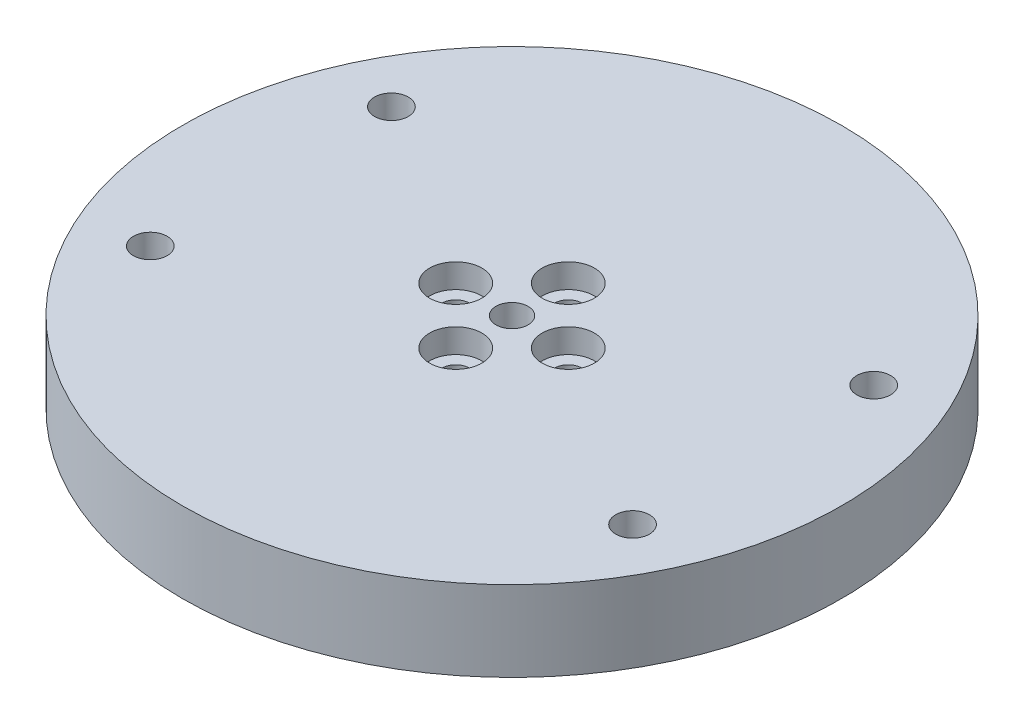
ISO-10303-21;
HEADER;
FILE_DESCRIPTION(('STEP AP214'),'2;1');
FILE_NAME('part.step','',(''),(''),'','','');
FILE_SCHEMA(('AUTOMOTIVE_DESIGN { 1 0 10303 214 1 1 1 1 }'));
ENDSEC;
DATA;
#1=APPLICATION_CONTEXT('core data for automotive mechanical design processes');
#2=APPLICATION_PROTOCOL_DEFINITION('international standard','automotive_design',2000,#1);
#3=PRODUCT_CONTEXT('',#1,'mechanical');
#4=PRODUCT('Part','Part','',(#3));
#5=PRODUCT_RELATED_PRODUCT_CATEGORY('part','',(#4));
#6=PRODUCT_DEFINITION_FORMATION('','',#4);
#7=PRODUCT_DEFINITION_CONTEXT('part definition',#1,'design');
#8=PRODUCT_DEFINITION('design','',#6,#7);
#9=PRODUCT_DEFINITION_SHAPE('','',#8);
#10=(LENGTH_UNIT() NAMED_UNIT(*) SI_UNIT(.MILLI.,.METRE.));
#11=(NAMED_UNIT(*) PLANE_ANGLE_UNIT() SI_UNIT($,.RADIAN.));
#12=(NAMED_UNIT(*) SI_UNIT($,.STERADIAN.) SOLID_ANGLE_UNIT());
#13=UNCERTAINTY_MEASURE_WITH_UNIT(LENGTH_MEASURE(1.E-05),#10,'distance_accuracy_value','');
#14=(GEOMETRIC_REPRESENTATION_CONTEXT(3) GLOBAL_UNCERTAINTY_ASSIGNED_CONTEXT((#13)) GLOBAL_UNIT_ASSIGNED_CONTEXT((#10,
#11,#12)) REPRESENTATION_CONTEXT('',''));
#15=CARTESIAN_POINT('',(0.,0.,0.));
#16=DIRECTION('',(0.,0.,1.));
#17=DIRECTION('',(1.,0.,0.));
#18=AXIS2_PLACEMENT_3D('',#15,#16,#17);
#19=CARTESIAN_POINT('',(7.,10.,0.));
#20=DIRECTION('',(0.,-1.,0.));
#21=DIRECTION('',(0.,0.,-1.));
#22=AXIS2_PLACEMENT_3D('',#19,#20,#21);
#23=CYLINDRICAL_SURFACE('',#22,1.7);
#24=CARTESIAN_POINT('',(7.,0.5,0.));
#25=DIRECTION('',(0.,-1.,0.));
#26=DIRECTION('',(0.,0.,-1.));
#27=AXIS2_PLACEMENT_3D('',#24,#25,#26);
#28=CIRCLE('',#27,1.7);
#29=CARTESIAN_POINT('',(7.,0.5,-1.70000000000002));
#30=VERTEX_POINT('',#29);
#31=EDGE_CURVE('E77',#30,#30,#28,.T.);
#32=ORIENTED_EDGE('',*,*,#31,.T.);
#33=EDGE_LOOP('',(#32));
#34=FACE_BOUND('',#33,.T.);
#35=CARTESIAN_POINT('',(7.,7.,0.));
#36=DIRECTION('',(0.,1.,0.));
#37=DIRECTION('',(0.,0.,1.));
#38=AXIS2_PLACEMENT_3D('',#35,#36,#37);
#39=CIRCLE('',#38,1.7);
#40=CARTESIAN_POINT('',(7.,7.,1.69999999999998));
#41=VERTEX_POINT('',#40);
#42=EDGE_CURVE('E43',#41,#41,#39,.F.);
#43=ORIENTED_EDGE('',*,*,#42,.F.);
#44=EDGE_LOOP('',(#43));
#45=FACE_BOUND('',#44,.T.);
#46=ADVANCED_FACE('F39',(#34,#45),#23,.F.);
#47=CARTESIAN_POINT('',(0.,10.,-7.));
#48=DIRECTION('',(0.,-1.,0.));
#49=DIRECTION('',(0.,0.,-1.));
#50=AXIS2_PLACEMENT_3D('',#47,#48,#49);
#51=CYLINDRICAL_SURFACE('',#50,1.7);
#52=CARTESIAN_POINT('',(0.,0.5,-7.));
#53=DIRECTION('',(0.,-1.,0.));
#54=DIRECTION('',(0.,0.,-1.));
#55=AXIS2_PLACEMENT_3D('',#52,#53,#54);
#56=CIRCLE('',#55,1.7);
#57=CARTESIAN_POINT('',(0.,0.5,-8.7));
#58=VERTEX_POINT('',#57);
#59=EDGE_CURVE('E71',#58,#58,#56,.T.);
#60=ORIENTED_EDGE('',*,*,#59,.T.);
#61=EDGE_LOOP('',(#60));
#62=FACE_BOUND('',#61,.T.);
#63=CARTESIAN_POINT('',(0.,7.,-7.));
#64=DIRECTION('',(0.,1.,0.));
#65=DIRECTION('',(0.,0.,1.));
#66=AXIS2_PLACEMENT_3D('',#63,#64,#65);
#67=CIRCLE('',#66,1.7);
#68=CARTESIAN_POINT('',(0.,7.,-5.3));
#69=VERTEX_POINT('',#68);
#70=EDGE_CURVE('E63',#69,#69,#67,.F.);
#71=ORIENTED_EDGE('',*,*,#70,.F.);
#72=EDGE_LOOP('',(#71));
#73=FACE_BOUND('',#72,.T.);
#74=ADVANCED_FACE('F187',(#62,#73),#51,.F.);
#75=CARTESIAN_POINT('',(-7.,10.,0.));
#76=DIRECTION('',(0.,-1.,0.));
#77=DIRECTION('',(0.,0.,-1.));
#78=AXIS2_PLACEMENT_3D('',#75,#76,#77);
#79=CYLINDRICAL_SURFACE('',#78,1.7);
#80=CARTESIAN_POINT('',(-7.,0.5,0.));
#81=DIRECTION('',(0.,-1.,0.));
#82=DIRECTION('',(0.,0.,-1.));
#83=AXIS2_PLACEMENT_3D('',#80,#81,#82);
#84=CIRCLE('',#83,1.7);
#85=CARTESIAN_POINT('',(-7.,0.5,-1.69999999999993));
#86=VERTEX_POINT('',#85);
#87=EDGE_CURVE('E69',#86,#86,#84,.T.);
#88=ORIENTED_EDGE('',*,*,#87,.T.);
#89=EDGE_LOOP('',(#88));
#90=FACE_BOUND('',#89,.T.);
#91=CARTESIAN_POINT('',(-7.,7.,0.));
#92=DIRECTION('',(0.,1.,0.));
#93=DIRECTION('',(0.,0.,1.));
#94=AXIS2_PLACEMENT_3D('',#91,#92,#93);
#95=CIRCLE('',#94,1.7);
#96=CARTESIAN_POINT('',(-7.,7.,1.70000000000007));
#97=VERTEX_POINT('',#96);
#98=EDGE_CURVE('E61',#97,#97,#95,.F.);
#99=ORIENTED_EDGE('',*,*,#98,.F.);
#100=EDGE_LOOP('',(#99));
#101=FACE_BOUND('',#100,.T.);
#102=ADVANCED_FACE('F191',(#90,#101),#79,.F.);
#103=CARTESIAN_POINT('',(0.,10.,7.));
#104=DIRECTION('',(0.,-1.,0.));
#105=DIRECTION('',(0.,0.,-1.));
#106=AXIS2_PLACEMENT_3D('',#103,#104,#105);
#107=CYLINDRICAL_SURFACE('',#106,1.7);
#108=CARTESIAN_POINT('',(0.,0.5,7.));
#109=DIRECTION('',(0.,-1.,0.));
#110=DIRECTION('',(0.,0.,-1.));
#111=AXIS2_PLACEMENT_3D('',#108,#109,#110);
#112=CIRCLE('',#111,1.7);
#113=CARTESIAN_POINT('',(0.,0.5,5.3));
#114=VERTEX_POINT('',#113);
#115=EDGE_CURVE('E82',#114,#114,#112,.T.);
#116=ORIENTED_EDGE('',*,*,#115,.T.);
#117=EDGE_LOOP('',(#116));
#118=FACE_BOUND('',#117,.T.);
#119=CARTESIAN_POINT('',(0.,7.,7.));
#120=DIRECTION('',(0.,1.,0.));
#121=DIRECTION('',(0.,0.,1.));
#122=AXIS2_PLACEMENT_3D('',#119,#120,#121);
#123=CIRCLE('',#122,1.7);
#124=CARTESIAN_POINT('',(0.,7.,8.7));
#125=VERTEX_POINT('',#124);
#126=EDGE_CURVE('E59',#125,#125,#123,.F.);
#127=ORIENTED_EDGE('',*,*,#126,.F.);
#128=EDGE_LOOP('',(#127));
#129=FACE_BOUND('',#128,.T.);
#130=ADVANCED_FACE('F200',(#118,#129),#107,.F.);
#131=CARTESIAN_POINT('',(0.,10.,0.));
#132=DIRECTION('',(0.,-1.,0.));
#133=DIRECTION('',(0.,0.,-1.));
#134=AXIS2_PLACEMENT_3D('',#131,#132,#133);
#135=CYLINDRICAL_SURFACE('',#134,41.);
#136=CARTESIAN_POINT('',(0.,10.,0.));
#137=DIRECTION('',(0.,1.,0.));
#138=DIRECTION('',(0.,0.,1.));
#139=AXIS2_PLACEMENT_3D('',#136,#137,#138);
#140=CIRCLE('',#139,41.);
#141=CARTESIAN_POINT('',(0.,10.,41.));
#142=VERTEX_POINT('',#141);
#143=EDGE_CURVE('E10',#142,#142,#140,.T.);
#144=ORIENTED_EDGE('',*,*,#143,.F.);
#145=EDGE_LOOP('',(#144));
#146=FACE_BOUND('',#145,.T.);
#147=CARTESIAN_POINT('',(0.,0.,0.));
#148=DIRECTION('',(0.,1.,0.));
#149=DIRECTION('',(0.,0.,1.));
#150=AXIS2_PLACEMENT_3D('',#147,#148,#149);
#151=CIRCLE('',#150,41.);
#152=CARTESIAN_POINT('',(0.,0.,41.));
#153=VERTEX_POINT('',#152);
#154=EDGE_CURVE('E50',#153,#153,#151,.T.);
#155=ORIENTED_EDGE('',*,*,#154,.T.);
#156=EDGE_LOOP('',(#155));
#157=FACE_BOUND('',#156,.T.);
#158=ADVANCED_FACE('F41',(#146,#157),#135,.T.);
#159=CARTESIAN_POINT('',(0.,10.,0.));
#160=DIRECTION('',(0.,1.,0.));
#161=DIRECTION('',(0.,0.,1.));
#162=AXIS2_PLACEMENT_3D('',#159,#160,#161);
#163=PLANE('',#162);
#164=CARTESIAN_POINT('',(-30.,10.,15.));
#165=DIRECTION('',(0.,1.,0.));
#166=DIRECTION('',(0.,0.,1.));
#167=AXIS2_PLACEMENT_3D('',#164,#165,#166);
#168=CIRCLE('',#167,2.1);
#169=CARTESIAN_POINT('',(-30.,10.,17.1));
#170=VERTEX_POINT('',#169);
#171=EDGE_CURVE('E130',#170,#170,#168,.T.);
#172=ORIENTED_EDGE('',*,*,#171,.F.);
#173=EDGE_LOOP('',(#172));
#174=FACE_BOUND('',#173,.T.);
#175=CARTESIAN_POINT('',(30.,10.,-15.));
#176=DIRECTION('',(0.,1.,0.));
#177=DIRECTION('',(0.,0.,1.));
#178=AXIS2_PLACEMENT_3D('',#175,#176,#177);
#179=CIRCLE('',#178,2.1);
#180=CARTESIAN_POINT('',(30.,10.,-12.9));
#181=VERTEX_POINT('',#180);
#182=EDGE_CURVE('E132',#181,#181,#179,.T.);
#183=ORIENTED_EDGE('',*,*,#182,.F.);
#184=EDGE_LOOP('',(#183));
#185=FACE_BOUND('',#184,.T.);
#186=CARTESIAN_POINT('',(30.,10.,15.));
#187=DIRECTION('',(0.,1.,0.));
#188=DIRECTION('',(0.,0.,1.));
#189=AXIS2_PLACEMENT_3D('',#186,#187,#188);
#190=CIRCLE('',#189,2.1);
#191=CARTESIAN_POINT('',(30.,10.,17.1));
#192=VERTEX_POINT('',#191);
#193=EDGE_CURVE('E133',#192,#192,#190,.T.);
#194=ORIENTED_EDGE('',*,*,#193,.F.);
#195=EDGE_LOOP('',(#194));
#196=FACE_BOUND('',#195,.T.);
#197=CARTESIAN_POINT('',(-30.,10.,-15.));
#198=DIRECTION('',(0.,1.,0.));
#199=DIRECTION('',(0.,0.,1.));
#200=AXIS2_PLACEMENT_3D('',#197,#198,#199);
#201=CIRCLE('',#200,2.1);
#202=CARTESIAN_POINT('',(-30.,10.,-12.9));
#203=VERTEX_POINT('',#202);
#204=EDGE_CURVE('E124',#203,#203,#201,.T.);
#205=ORIENTED_EDGE('',*,*,#204,.F.);
#206=EDGE_LOOP('',(#205));
#207=FACE_BOUND('',#206,.T.);
#208=CARTESIAN_POINT('',(0.,10.,-7.));
#209=DIRECTION('',(0.,1.,0.));
#210=DIRECTION('',(0.,0.,1.));
#211=AXIS2_PLACEMENT_3D('',#208,#209,#210);
#212=CIRCLE('',#211,3.25);
#213=CARTESIAN_POINT('',(0.,10.,-3.75));
#214=VERTEX_POINT('',#213);
#215=EDGE_CURVE('E118',#214,#214,#212,.T.);
#216=ORIENTED_EDGE('',*,*,#215,.F.);
#217=EDGE_LOOP('',(#216));
#218=FACE_BOUND('',#217,.T.);
#219=CARTESIAN_POINT('',(7.,10.,0.));
#220=DIRECTION('',(0.,1.,0.));
#221=DIRECTION('',(0.,0.,1.));
#222=AXIS2_PLACEMENT_3D('',#219,#220,#221);
#223=CIRCLE('',#222,3.25);
#224=CARTESIAN_POINT('',(7.,10.,3.24999999999998));
#225=VERTEX_POINT('',#224);
#226=EDGE_CURVE('E116',#225,#225,#223,.T.);
#227=ORIENTED_EDGE('',*,*,#226,.F.);
#228=EDGE_LOOP('',(#227));
#229=FACE_BOUND('',#228,.T.);
#230=CARTESIAN_POINT('',(0.,10.,7.));
#231=DIRECTION('',(0.,1.,0.));
#232=DIRECTION('',(0.,0.,1.));
#233=AXIS2_PLACEMENT_3D('',#230,#231,#232);
#234=CIRCLE('',#233,3.25);
#235=CARTESIAN_POINT('',(0.,10.,10.25));
#236=VERTEX_POINT('',#235);
#237=EDGE_CURVE('E109',#236,#236,#234,.T.);
#238=ORIENTED_EDGE('',*,*,#237,.F.);
#239=EDGE_LOOP('',(#238));
#240=FACE_BOUND('',#239,.T.);
#241=CARTESIAN_POINT('',(-7.,10.,0.));
#242=DIRECTION('',(0.,1.,0.));
#243=DIRECTION('',(0.,0.,1.));
#244=AXIS2_PLACEMENT_3D('',#241,#242,#243);
#245=CIRCLE('',#244,3.25);
#246=CARTESIAN_POINT('',(-7.,10.,3.24999999999998));
#247=VERTEX_POINT('',#246);
#248=EDGE_CURVE('E103',#247,#247,#245,.T.);
#249=ORIENTED_EDGE('',*,*,#248,.F.);
#250=EDGE_LOOP('',(#249));
#251=FACE_BOUND('',#250,.T.);
#252=CARTESIAN_POINT('',(0.,10.,0.));
#253=DIRECTION('',(0.,-1.,0.));
#254=DIRECTION('',(0.,0.,-1.));
#255=AXIS2_PLACEMENT_3D('',#252,#253,#254);
#256=CIRCLE('',#255,2.);
#257=CARTESIAN_POINT('',(0.,10.,-2.));
#258=VERTEX_POINT('',#257);
#259=EDGE_CURVE('E88',#258,#258,#256,.T.);
#260=ORIENTED_EDGE('',*,*,#259,.T.);
#261=EDGE_LOOP('',(#260));
#262=FACE_BOUND('',#261,.T.);
#263=ORIENTED_EDGE('',*,*,#143,.T.);
#264=EDGE_LOOP('',(#263));
#265=FACE_BOUND('',#264,.T.);
#266=ADVANCED_FACE('F147',(#174,#185,#196,#207,#218,#229,#240,#251,#262,#265),#163,.T.);
#267=CARTESIAN_POINT('',(0.,0.,0.));
#268=DIRECTION('',(0.,1.,0.));
#269=DIRECTION('',(0.,0.,1.));
#270=AXIS2_PLACEMENT_3D('',#267,#268,#269);
#271=PLANE('',#270);
#272=CARTESIAN_POINT('',(0.,0.,0.));
#273=DIRECTION('',(0.,-1.,0.));
#274=DIRECTION('',(0.,0.,-1.));
#275=AXIS2_PLACEMENT_3D('',#272,#273,#274);
#276=CIRCLE('',#275,10.1);
#277=CARTESIAN_POINT('',(0.,0.,-10.1));
#278=VERTEX_POINT('',#277);
#279=EDGE_CURVE('E54',#278,#278,#276,.T.);
#280=ORIENTED_EDGE('',*,*,#279,.F.);
#281=EDGE_LOOP('',(#280));
#282=FACE_BOUND('',#281,.T.);
#283=ORIENTED_EDGE('',*,*,#154,.F.);
#284=EDGE_LOOP('',(#283));
#285=FACE_BOUND('',#284,.T.);
#286=ADVANCED_FACE('F153',(#282,#285),#271,.F.);
#287=CARTESIAN_POINT('',(0.,0.5,0.));
#288=DIRECTION('',(0.,-1.,0.));
#289=DIRECTION('',(0.,0.,-1.));
#290=AXIS2_PLACEMENT_3D('',#287,#288,#289);
#291=CYLINDRICAL_SURFACE('',#290,10.1);
#292=CARTESIAN_POINT('',(0.,0.5,0.));
#293=DIRECTION('',(0.,-1.,0.));
#294=DIRECTION('',(0.,0.,-1.));
#295=AXIS2_PLACEMENT_3D('',#292,#293,#294);
#296=CIRCLE('',#295,10.1);
#297=CARTESIAN_POINT('',(0.,0.5,-10.1));
#298=VERTEX_POINT('',#297);
#299=EDGE_CURVE('E55',#298,#298,#296,.T.);
#300=ORIENTED_EDGE('',*,*,#299,.F.);
#301=EDGE_LOOP('',(#300));
#302=FACE_BOUND('',#301,.T.);
#303=ORIENTED_EDGE('',*,*,#279,.T.);
#304=EDGE_LOOP('',(#303));
#305=FACE_BOUND('',#304,.T.);
#306=ADVANCED_FACE('F180',(#302,#305),#291,.F.);
#307=CARTESIAN_POINT('',(0.,0.5,0.));
#308=DIRECTION('',(0.,-1.,0.));
#309=DIRECTION('',(0.,0.,-1.));
#310=AXIS2_PLACEMENT_3D('',#307,#308,#309);
#311=PLANE('',#310);
#312=ORIENTED_EDGE('',*,*,#115,.F.);
#313=EDGE_LOOP('',(#312));
#314=FACE_BOUND('',#313,.T.);
#315=ORIENTED_EDGE('',*,*,#87,.F.);
#316=EDGE_LOOP('',(#315));
#317=FACE_BOUND('',#316,.T.);
#318=ORIENTED_EDGE('',*,*,#59,.F.);
#319=EDGE_LOOP('',(#318));
#320=FACE_BOUND('',#319,.T.);
#321=ORIENTED_EDGE('',*,*,#31,.F.);
#322=EDGE_LOOP('',(#321));
#323=FACE_BOUND('',#322,.T.);
#324=CARTESIAN_POINT('',(0.,0.5,0.));
#325=DIRECTION('',(0.,-1.,0.));
#326=DIRECTION('',(0.,0.,-1.));
#327=AXIS2_PLACEMENT_3D('',#324,#325,#326);
#328=CIRCLE('',#327,2.);
#329=CARTESIAN_POINT('',(0.,0.5,-2.));
#330=VERTEX_POINT('',#329);
#331=EDGE_CURVE('E85',#330,#330,#328,.T.);
#332=ORIENTED_EDGE('',*,*,#331,.F.);
#333=EDGE_LOOP('',(#332));
#334=FACE_BOUND('',#333,.T.);
#335=ORIENTED_EDGE('',*,*,#299,.T.);
#336=EDGE_LOOP('',(#335));
#337=FACE_BOUND('',#336,.T.);
#338=ADVANCED_FACE('F175',(#314,#317,#320,#323,#334,#337),#311,.T.);
#339=CARTESIAN_POINT('',(0.,10.,0.));
#340=DIRECTION('',(0.,-1.,0.));
#341=DIRECTION('',(0.,0.,-1.));
#342=AXIS2_PLACEMENT_3D('',#339,#340,#341);
#343=CYLINDRICAL_SURFACE('',#342,2.);
#344=ORIENTED_EDGE('',*,*,#259,.F.);
#345=EDGE_LOOP('',(#344));
#346=FACE_BOUND('',#345,.T.);
#347=ORIENTED_EDGE('',*,*,#331,.T.);
#348=EDGE_LOOP('',(#347));
#349=FACE_BOUND('',#348,.T.);
#350=ADVANCED_FACE('F169',(#346,#349),#343,.F.);
#351=CARTESIAN_POINT('',(0.,7.,7.));
#352=DIRECTION('',(0.,1.,0.));
#353=DIRECTION('',(0.,0.,1.));
#354=AXIS2_PLACEMENT_3D('',#351,#352,#353);
#355=PLANE('',#354);
#356=CARTESIAN_POINT('',(0.,7.,7.));
#357=DIRECTION('',(0.,1.,0.));
#358=DIRECTION('',(0.,0.,1.));
#359=AXIS2_PLACEMENT_3D('',#356,#357,#358);
#360=CIRCLE('',#359,3.25);
#361=CARTESIAN_POINT('',(0.,7.,10.25));
#362=VERTEX_POINT('',#361);
#363=EDGE_CURVE('E110',#362,#362,#360,.T.);
#364=ORIENTED_EDGE('',*,*,#363,.T.);
#365=EDGE_LOOP('',(#364));
#366=FACE_BOUND('',#365,.T.);
#367=ORIENTED_EDGE('',*,*,#126,.T.);
#368=EDGE_LOOP('',(#367));
#369=FACE_BOUND('',#368,.T.);
#370=ADVANCED_FACE('F171',(#366,#369),#355,.T.);
#371=CARTESIAN_POINT('',(0.,7.,7.));
#372=DIRECTION('',(0.,1.,0.));
#373=DIRECTION('',(0.,0.,1.));
#374=AXIS2_PLACEMENT_3D('',#371,#372,#373);
#375=CYLINDRICAL_SURFACE('',#374,3.25);
#376=ORIENTED_EDGE('',*,*,#363,.F.);
#377=EDGE_LOOP('',(#376));
#378=FACE_BOUND('',#377,.T.);
#379=ORIENTED_EDGE('',*,*,#237,.T.);
#380=EDGE_LOOP('',(#379));
#381=FACE_BOUND('',#380,.T.);
#382=ADVANCED_FACE('F210',(#378,#381),#375,.F.);
#383=CARTESIAN_POINT('',(-7.,7.,0.));
#384=DIRECTION('',(0.,1.,0.));
#385=DIRECTION('',(0.,0.,1.));
#386=AXIS2_PLACEMENT_3D('',#383,#384,#385);
#387=PLANE('',#386);
#388=CARTESIAN_POINT('',(-7.,7.,0.));
#389=DIRECTION('',(0.,1.,0.));
#390=DIRECTION('',(0.,0.,1.));
#391=AXIS2_PLACEMENT_3D('',#388,#389,#390);
#392=CIRCLE('',#391,3.25);
#393=CARTESIAN_POINT('',(-7.,7.,3.24999999999998));
#394=VERTEX_POINT('',#393);
#395=EDGE_CURVE('E99',#394,#394,#392,.T.);
#396=ORIENTED_EDGE('',*,*,#395,.T.);
#397=EDGE_LOOP('',(#396));
#398=FACE_BOUND('',#397,.T.);
#399=ORIENTED_EDGE('',*,*,#98,.T.);
#400=EDGE_LOOP('',(#399));
#401=FACE_BOUND('',#400,.T.);
#402=ADVANCED_FACE('F201',(#398,#401),#387,.T.);
#403=CARTESIAN_POINT('',(-7.,7.,0.));
#404=DIRECTION('',(0.,1.,0.));
#405=DIRECTION('',(0.,0.,1.));
#406=AXIS2_PLACEMENT_3D('',#403,#404,#405);
#407=CYLINDRICAL_SURFACE('',#406,3.25);
#408=ORIENTED_EDGE('',*,*,#395,.F.);
#409=EDGE_LOOP('',(#408));
#410=FACE_BOUND('',#409,.T.);
#411=ORIENTED_EDGE('',*,*,#248,.T.);
#412=EDGE_LOOP('',(#411));
#413=FACE_BOUND('',#412,.T.);
#414=ADVANCED_FACE('F206',(#410,#413),#407,.F.);
#415=CARTESIAN_POINT('',(0.,7.,-7.));
#416=DIRECTION('',(0.,1.,0.));
#417=DIRECTION('',(0.,0.,1.));
#418=AXIS2_PLACEMENT_3D('',#415,#416,#417);
#419=PLANE('',#418);
#420=CARTESIAN_POINT('',(0.,7.,-7.));
#421=DIRECTION('',(0.,1.,0.));
#422=DIRECTION('',(0.,0.,1.));
#423=AXIS2_PLACEMENT_3D('',#420,#421,#422);
#424=CIRCLE('',#423,3.25);
#425=CARTESIAN_POINT('',(0.,7.,-3.75));
#426=VERTEX_POINT('',#425);
#427=EDGE_CURVE('E65',#426,#426,#424,.T.);
#428=ORIENTED_EDGE('',*,*,#427,.T.);
#429=EDGE_LOOP('',(#428));
#430=FACE_BOUND('',#429,.T.);
#431=ORIENTED_EDGE('',*,*,#70,.T.);
#432=EDGE_LOOP('',(#431));
#433=FACE_BOUND('',#432,.T.);
#434=ADVANCED_FACE('F211',(#430,#433),#419,.T.);
#435=CARTESIAN_POINT('',(0.,7.,-7.));
#436=DIRECTION('',(0.,1.,0.));
#437=DIRECTION('',(0.,0.,1.));
#438=AXIS2_PLACEMENT_3D('',#435,#436,#437);
#439=CYLINDRICAL_SURFACE('',#438,3.25);
#440=ORIENTED_EDGE('',*,*,#427,.F.);
#441=EDGE_LOOP('',(#440));
#442=FACE_BOUND('',#441,.T.);
#443=ORIENTED_EDGE('',*,*,#215,.T.);
#444=EDGE_LOOP('',(#443));
#445=FACE_BOUND('',#444,.T.);
#446=ADVANCED_FACE('F224',(#442,#445),#439,.F.);
#447=CARTESIAN_POINT('',(7.,7.,0.));
#448=DIRECTION('',(0.,1.,0.));
#449=DIRECTION('',(0.,0.,1.));
#450=AXIS2_PLACEMENT_3D('',#447,#448,#449);
#451=PLANE('',#450);
#452=CARTESIAN_POINT('',(7.,7.,0.));
#453=DIRECTION('',(0.,1.,0.));
#454=DIRECTION('',(0.,0.,1.));
#455=AXIS2_PLACEMENT_3D('',#452,#453,#454);
#456=CIRCLE('',#455,3.25);
#457=CARTESIAN_POINT('',(7.,7.,3.24999999999998));
#458=VERTEX_POINT('',#457);
#459=EDGE_CURVE('E114',#458,#458,#456,.T.);
#460=ORIENTED_EDGE('',*,*,#459,.T.);
#461=EDGE_LOOP('',(#460));
#462=FACE_BOUND('',#461,.T.);
#463=ORIENTED_EDGE('',*,*,#42,.T.);
#464=EDGE_LOOP('',(#463));
#465=FACE_BOUND('',#464,.T.);
#466=ADVANCED_FACE('F218',(#462,#465),#451,.T.);
#467=CARTESIAN_POINT('',(7.,7.,0.));
#468=DIRECTION('',(0.,1.,0.));
#469=DIRECTION('',(0.,0.,1.));
#470=AXIS2_PLACEMENT_3D('',#467,#468,#469);
#471=CYLINDRICAL_SURFACE('',#470,3.25);
#472=ORIENTED_EDGE('',*,*,#459,.F.);
#473=EDGE_LOOP('',(#472));
#474=FACE_BOUND('',#473,.T.);
#475=ORIENTED_EDGE('',*,*,#226,.T.);
#476=EDGE_LOOP('',(#475));
#477=FACE_BOUND('',#476,.T.);
#478=ADVANCED_FACE('F225',(#474,#477),#471,.F.);
#479=CARTESIAN_POINT('',(-30.,4.5,-15.));
#480=DIRECTION('',(0.,1.,0.));
#481=DIRECTION('',(0.,0.,1.));
#482=AXIS2_PLACEMENT_3D('',#479,#480,#481);
#483=CYLINDRICAL_SURFACE('',#482,2.1);
#484=CARTESIAN_POINT('',(-30.,4.5,-15.));
#485=DIRECTION('',(0.,1.,0.));
#486=DIRECTION('',(0.,0.,1.));
#487=AXIS2_PLACEMENT_3D('',#484,#485,#486);
#488=CIRCLE('',#487,2.1);
#489=CARTESIAN_POINT('',(-30.,4.5,-12.9));
#490=VERTEX_POINT('',#489);
#491=EDGE_CURVE('E102',#490,#490,#488,.T.);
#492=ORIENTED_EDGE('',*,*,#491,.F.);
#493=EDGE_LOOP('',(#492));
#494=FACE_BOUND('',#493,.T.);
#495=ORIENTED_EDGE('',*,*,#204,.T.);
#496=EDGE_LOOP('',(#495));
#497=FACE_BOUND('',#496,.T.);
#498=ADVANCED_FACE('F230',(#494,#497),#483,.F.);
#499=CARTESIAN_POINT('',(-30.,4.5,-15.));
#500=DIRECTION('',(0.,1.,0.));
#501=DIRECTION('',(0.,0.,1.));
#502=AXIS2_PLACEMENT_3D('',#499,#500,#501);
#503=PLANE('',#502);
#504=ORIENTED_EDGE('',*,*,#491,.T.);
#505=EDGE_LOOP('',(#504));
#506=FACE_BOUND('',#505,.T.);
#507=ADVANCED_FACE('F240',(#506),#503,.T.);
#508=CARTESIAN_POINT('',(30.,4.5,15.));
#509=DIRECTION('',(0.,1.,0.));
#510=DIRECTION('',(0.,0.,1.));
#511=AXIS2_PLACEMENT_3D('',#508,#509,#510);
#512=CYLINDRICAL_SURFACE('',#511,2.1);
#513=CARTESIAN_POINT('',(30.,4.5,15.));
#514=DIRECTION('',(0.,1.,0.));
#515=DIRECTION('',(0.,0.,1.));
#516=AXIS2_PLACEMENT_3D('',#513,#514,#515);
#517=CIRCLE('',#516,2.1);
#518=CARTESIAN_POINT('',(30.,4.5,17.1));
#519=VERTEX_POINT('',#518);
#520=EDGE_CURVE('E142',#519,#519,#517,.T.);
#521=ORIENTED_EDGE('',*,*,#520,.F.);
#522=EDGE_LOOP('',(#521));
#523=FACE_BOUND('',#522,.T.);
#524=ORIENTED_EDGE('',*,*,#193,.T.);
#525=EDGE_LOOP('',(#524));
#526=FACE_BOUND('',#525,.T.);
#527=ADVANCED_FACE('F146',(#523,#526),#512,.F.);
#528=CARTESIAN_POINT('',(30.,4.5,15.));
#529=DIRECTION('',(0.,1.,0.));
#530=DIRECTION('',(0.,0.,1.));
#531=AXIS2_PLACEMENT_3D('',#528,#529,#530);
#532=PLANE('',#531);
#533=ORIENTED_EDGE('',*,*,#520,.T.);
#534=EDGE_LOOP('',(#533));
#535=FACE_BOUND('',#534,.T.);
#536=ADVANCED_FACE('F247',(#535),#532,.T.);
#537=CARTESIAN_POINT('',(30.,4.5,-15.));
#538=DIRECTION('',(0.,1.,0.));
#539=DIRECTION('',(0.,0.,1.));
#540=AXIS2_PLACEMENT_3D('',#537,#538,#539);
#541=CYLINDRICAL_SURFACE('',#540,2.1);
#542=CARTESIAN_POINT('',(30.,4.5,-15.));
#543=DIRECTION('',(0.,1.,0.));
#544=DIRECTION('',(0.,0.,1.));
#545=AXIS2_PLACEMENT_3D('',#542,#543,#544);
#546=CIRCLE('',#545,2.1);
#547=CARTESIAN_POINT('',(30.,4.5,-12.9));
#548=VERTEX_POINT('',#547);
#549=EDGE_CURVE('E128',#548,#548,#546,.T.);
#550=ORIENTED_EDGE('',*,*,#549,.F.);
#551=EDGE_LOOP('',(#550));
#552=FACE_BOUND('',#551,.T.);
#553=ORIENTED_EDGE('',*,*,#182,.T.);
#554=EDGE_LOOP('',(#553));
#555=FACE_BOUND('',#554,.T.);
#556=ADVANCED_FACE('F248',(#552,#555),#541,.F.);
#557=CARTESIAN_POINT('',(30.,4.5,-15.));
#558=DIRECTION('',(0.,1.,0.));
#559=DIRECTION('',(0.,0.,1.));
#560=AXIS2_PLACEMENT_3D('',#557,#558,#559);
#561=PLANE('',#560);
#562=ORIENTED_EDGE('',*,*,#549,.T.);
#563=EDGE_LOOP('',(#562));
#564=FACE_BOUND('',#563,.T.);
#565=ADVANCED_FACE('F245',(#564),#561,.T.);
#566=CARTESIAN_POINT('',(-30.,4.5,15.));
#567=DIRECTION('',(0.,1.,0.));
#568=DIRECTION('',(0.,0.,1.));
#569=AXIS2_PLACEMENT_3D('',#566,#567,#568);
#570=CYLINDRICAL_SURFACE('',#569,2.1);
#571=CARTESIAN_POINT('',(-30.,4.5,15.));
#572=DIRECTION('',(0.,1.,0.));
#573=DIRECTION('',(0.,0.,1.));
#574=AXIS2_PLACEMENT_3D('',#571,#572,#573);
#575=CIRCLE('',#574,2.1);
#576=CARTESIAN_POINT('',(-30.,4.5,17.1));
#577=VERTEX_POINT('',#576);
#578=EDGE_CURVE('E140',#577,#577,#575,.T.);
#579=ORIENTED_EDGE('',*,*,#578,.F.);
#580=EDGE_LOOP('',(#579));
#581=FACE_BOUND('',#580,.T.);
#582=ORIENTED_EDGE('',*,*,#171,.T.);
#583=EDGE_LOOP('',(#582));
#584=FACE_BOUND('',#583,.T.);
#585=ADVANCED_FACE('F244',(#581,#584),#570,.F.);
#586=CARTESIAN_POINT('',(-30.,4.5,15.));
#587=DIRECTION('',(0.,1.,0.));
#588=DIRECTION('',(0.,0.,1.));
#589=AXIS2_PLACEMENT_3D('',#586,#587,#588);
#590=PLANE('',#589);
#591=ORIENTED_EDGE('',*,*,#578,.T.);
#592=EDGE_LOOP('',(#591));
#593=FACE_BOUND('',#592,.T.);
#594=ADVANCED_FACE('F252',(#593),#590,.T.);
#595=CLOSED_SHELL('',(#46,#74,#102,#130,#158,#266,#286,#306,#338,#350,#370,#382,#402,#414,#434,
#446,#466,#478,#498,#507,#527,#536,#556,#565,#585,#594));
#596=MANIFOLD_SOLID_BREP('B2',#595);
#597=ADVANCED_BREP_SHAPE_REPRESENTATION('',(#18,#596),#14);
#598=SHAPE_DEFINITION_REPRESENTATION(#9,#597);
ENDSEC;
END-ISO-10303-21;
